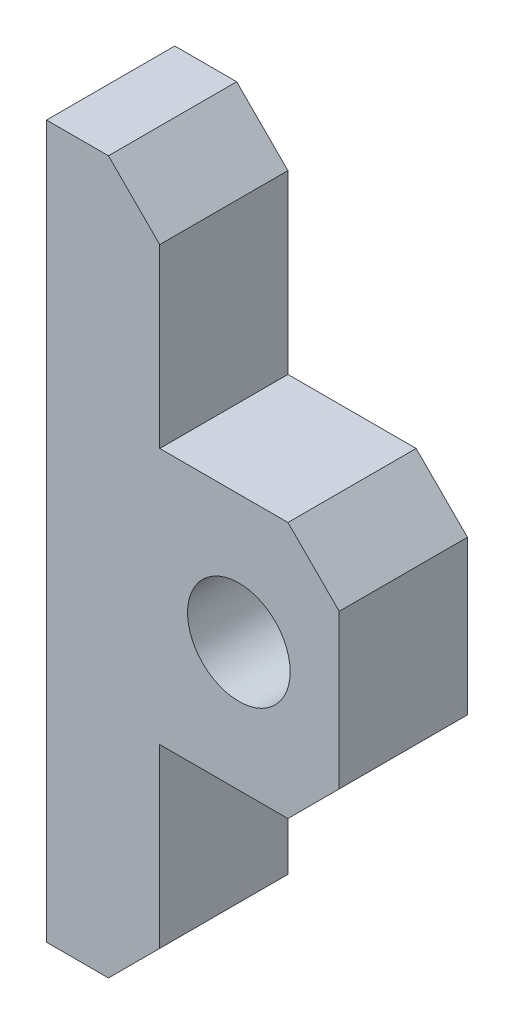
ISO-10303-21;
HEADER;
FILE_DESCRIPTION(('STEP AP214'),'2;1');
FILE_NAME('part.step','',(''),(''),'','','');
FILE_SCHEMA(('AUTOMOTIVE_DESIGN { 1 0 10303 214 1 1 1 1 }'));
ENDSEC;
DATA;
#1=APPLICATION_CONTEXT('core data for automotive mechanical design processes');
#2=APPLICATION_PROTOCOL_DEFINITION('international standard','automotive_design',2000,#1);
#3=PRODUCT_CONTEXT('',#1,'mechanical');
#4=PRODUCT('Part','Part','',(#3));
#5=PRODUCT_RELATED_PRODUCT_CATEGORY('part','',(#4));
#6=PRODUCT_DEFINITION_FORMATION('','',#4);
#7=PRODUCT_DEFINITION_CONTEXT('part definition',#1,'design');
#8=PRODUCT_DEFINITION('design','',#6,#7);
#9=PRODUCT_DEFINITION_SHAPE('','',#8);
#10=(LENGTH_UNIT() NAMED_UNIT(*) SI_UNIT(.MILLI.,.METRE.));
#11=(NAMED_UNIT(*) PLANE_ANGLE_UNIT() SI_UNIT($,.RADIAN.));
#12=(NAMED_UNIT(*) SI_UNIT($,.STERADIAN.) SOLID_ANGLE_UNIT());
#13=UNCERTAINTY_MEASURE_WITH_UNIT(LENGTH_MEASURE(1.E-05),#10,'distance_accuracy_value','');
#14=(GEOMETRIC_REPRESENTATION_CONTEXT(3) GLOBAL_UNCERTAINTY_ASSIGNED_CONTEXT((#13)) GLOBAL_UNIT_ASSIGNED_CONTEXT((#10,
#11,#12)) REPRESENTATION_CONTEXT('',''));
#15=CARTESIAN_POINT('',(0.,0.,0.));
#16=DIRECTION('',(0.,0.,1.));
#17=DIRECTION('',(1.,0.,0.));
#18=AXIS2_PLACEMENT_3D('',#15,#16,#17);
#19=CARTESIAN_POINT('',(25.,-12.8601720103916,10.));
#20=DIRECTION('',(0.,0.,1.));
#21=DIRECTION('',(1.,0.,0.));
#22=AXIS2_PLACEMENT_3D('',#19,#20,#21);
#23=PLANE('',#22);
#24=DIRECTION('',(0.,-1.,0.));
#25=VECTOR('',#24,1.);
#26=CARTESIAN_POINT('',(8.82861320662202,-50.6305555757172,10.));
#27=LINE('',#26,#25);
#28=CARTESIAN_POINT('',(8.82861320662202,-50.6305555757172,10.));
#29=VERTEX_POINT('',#28);
#30=CARTESIAN_POINT('',(8.82861320662203,-64.4009391410427,10.));
#31=VERTEX_POINT('',#30);
#32=EDGE_CURVE('E123',#29,#31,#27,.T.);
#33=ORIENTED_EDGE('',*,*,#32,.T.);
#34=DIRECTION('',(0.707106781186546,0.707106781186549,0.));
#35=VECTOR('',#34,1.);
#36=CARTESIAN_POINT('',(4.82861320662202,-68.4009391410427,10.));
#37=LINE('',#36,#35);
#38=CARTESIAN_POINT('',(4.82861320662202,-68.4009391410427,10.));
#39=VERTEX_POINT('',#38);
#40=EDGE_CURVE('E203',#31,#39,#37,.F.);
#41=ORIENTED_EDGE('',*,*,#40,.T.);
#42=DIRECTION('',(-1.,0.,0.));
#43=VECTOR('',#42,1.);
#44=CARTESIAN_POINT('',(25.,-68.4009391410427,10.));
#45=LINE('',#44,#43);
#46=CARTESIAN_POINT('',(0.,-68.4009391410427,10.));
#47=VERTEX_POINT('',#46);
#48=EDGE_CURVE('E178',#39,#47,#45,.T.);
#49=ORIENTED_EDGE('',*,*,#48,.T.);
#50=DIRECTION('',(0.,1.,0.));
#51=VECTOR('',#50,1.);
#52=CARTESIAN_POINT('',(0.,-12.8601720103916,10.));
#53=LINE('',#52,#51);
#54=CARTESIAN_POINT('',(0.,-12.8601720103916,10.));
#55=VERTEX_POINT('',#54);
#56=EDGE_CURVE('E164',#47,#55,#53,.T.);
#57=ORIENTED_EDGE('',*,*,#56,.T.);
#58=DIRECTION('',(-1.,0.,0.));
#59=VECTOR('',#58,1.);
#60=CARTESIAN_POINT('',(25.,-12.8601720103916,10.));
#61=LINE('',#60,#59);
#62=CARTESIAN_POINT('',(4.82861320662201,-12.8601720103916,10.));
#63=VERTEX_POINT('',#62);
#64=EDGE_CURVE('E184',#63,#55,#61,.T.);
#65=ORIENTED_EDGE('',*,*,#64,.F.);
#66=DIRECTION('',(-0.707106781186549,0.707106781186546,0.));
#67=VECTOR('',#66,1.);
#68=CARTESIAN_POINT('',(8.82861320662202,-16.8601720103916,10.));
#69=LINE('',#68,#67);
#70=CARTESIAN_POINT('',(8.82861320662202,-16.8601720103916,10.));
#71=VERTEX_POINT('',#70);
#72=EDGE_CURVE('E201',#63,#71,#69,.F.);
#73=ORIENTED_EDGE('',*,*,#72,.T.);
#74=DIRECTION('',(0.,-1.,0.));
#75=VECTOR('',#74,1.);
#76=CARTESIAN_POINT('',(8.82861320662202,-30.6305555757171,10.));
#77=LINE('',#76,#75);
#78=CARTESIAN_POINT('',(8.82861320662202,-30.6305555757171,10.));
#79=VERTEX_POINT('',#78);
#80=EDGE_CURVE('E138',#71,#79,#77,.T.);
#81=ORIENTED_EDGE('',*,*,#80,.T.);
#82=DIRECTION('',(1.,0.,0.));
#83=VECTOR('',#82,1.);
#84=CARTESIAN_POINT('',(22.828613206622,-30.6305555757171,10.));
#85=LINE('',#84,#83);
#86=CARTESIAN_POINT('',(18.828613206622,-30.6305555757171,10.));
#87=VERTEX_POINT('',#86);
#88=EDGE_CURVE('E157',#79,#87,#85,.T.);
#89=ORIENTED_EDGE('',*,*,#88,.T.);
#90=DIRECTION('',(-0.707106781186549,0.707106781186546,0.));
#91=VECTOR('',#90,1.);
#92=CARTESIAN_POINT('',(22.828613206622,-34.6305555757172,10.));
#93=LINE('',#92,#91);
#94=CARTESIAN_POINT('',(22.828613206622,-34.6305555757172,10.));
#95=VERTEX_POINT('',#94);
#96=EDGE_CURVE('E199',#87,#95,#93,.F.);
#97=ORIENTED_EDGE('',*,*,#96,.T.);
#98=DIRECTION('',(0.,-1.,0.));
#99=VECTOR('',#98,1.);
#100=CARTESIAN_POINT('',(22.828613206622,-50.6305555757172,10.));
#101=LINE('',#100,#99);
#102=CARTESIAN_POINT('',(22.828613206622,-46.6305555757171,10.));
#103=VERTEX_POINT('',#102);
#104=EDGE_CURVE('E127',#95,#103,#101,.T.);
#105=ORIENTED_EDGE('',*,*,#104,.T.);
#106=DIRECTION('',(0.707106781186547,0.707106781186548,0.));
#107=VECTOR('',#106,1.);
#108=CARTESIAN_POINT('',(18.828613206622,-50.6305555757172,10.));
#109=LINE('',#108,#107);
#110=CARTESIAN_POINT('',(18.828613206622,-50.6305555757172,10.));
#111=VERTEX_POINT('',#110);
#112=EDGE_CURVE('E45',#103,#111,#109,.F.);
#113=ORIENTED_EDGE('',*,*,#112,.T.);
#114=DIRECTION('',(-1.,0.,0.));
#115=VECTOR('',#114,1.);
#116=CARTESIAN_POINT('',(22.828613206622,-50.6305555757172,10.));
#117=LINE('',#116,#115);
#118=EDGE_CURVE('E119',#111,#29,#117,.T.);
#119=ORIENTED_EDGE('',*,*,#118,.T.);
#120=EDGE_LOOP('',(#33,#41,#49,#57,#65,#73,#81,#89,#97,#105,#113,#119));
#121=FACE_BOUND('',#120,.T.);
#122=CARTESIAN_POINT('',(15.,-40.6305555757172,10.));
#123=DIRECTION('',(0.,0.,1.));
#124=DIRECTION('',(1.,0.,0.));
#125=AXIS2_PLACEMENT_3D('',#122,#123,#124);
#126=CIRCLE('',#125,4.00000000104675);
#127=CARTESIAN_POINT('',(19.0000000010468,-40.6305555757172,10.));
#128=VERTEX_POINT('',#127);
#129=EDGE_CURVE('E161',#128,#128,#126,.T.);
#130=ORIENTED_EDGE('',*,*,#129,.T.);
#131=EDGE_LOOP('',(#130));
#132=FACE_BOUND('',#131,.T.);
#133=ADVANCED_FACE('F30',(#121,#132),#23,.F.);
#134=CARTESIAN_POINT('',(25.,-12.8601720103916,20.));
#135=DIRECTION('',(0.,-1.,0.));
#136=DIRECTION('',(0.,0.,-1.));
#137=AXIS2_PLACEMENT_3D('',#134,#135,#136);
#138=PLANE('',#137);
#139=DIRECTION('',(-1.,0.,0.));
#140=VECTOR('',#139,1.);
#141=CARTESIAN_POINT('',(25.,-12.8601720103916,20.));
#142=LINE('',#141,#140);
#143=CARTESIAN_POINT('',(4.82861320662201,-12.8601720103916,20.));
#144=VERTEX_POINT('',#143);
#145=CARTESIAN_POINT('',(0.,-12.8601720103916,20.));
#146=VERTEX_POINT('',#145);
#147=EDGE_CURVE('E182',#144,#146,#142,.T.);
#148=ORIENTED_EDGE('',*,*,#147,.F.);
#149=DIRECTION('',(0.,0.,-1.));
#150=VECTOR('',#149,1.);
#151=CARTESIAN_POINT('',(4.82861320662201,-12.8601720103916,20.));
#152=LINE('',#151,#150);
#153=EDGE_CURVE('E208',#144,#63,#152,.T.);
#154=ORIENTED_EDGE('',*,*,#153,.T.);
#155=ORIENTED_EDGE('',*,*,#64,.T.);
#156=DIRECTION('',(0.,0.,1.));
#157=VECTOR('',#156,1.);
#158=CARTESIAN_POINT('',(0.,-12.8601720103916,20.));
#159=LINE('',#158,#157);
#160=EDGE_CURVE('E169',#55,#146,#159,.T.);
#161=ORIENTED_EDGE('',*,*,#160,.T.);
#162=EDGE_LOOP('',(#148,#154,#155,#161));
#163=FACE_BOUND('',#162,.T.);
#164=ADVANCED_FACE('F238',(#163),#138,.F.);
#165=CARTESIAN_POINT('',(25.,-12.8601720103916,20.));
#166=DIRECTION('',(0.,0.,-1.));
#167=DIRECTION('',(-1.,0.,0.));
#168=AXIS2_PLACEMENT_3D('',#165,#166,#167);
#169=PLANE('',#168);
#170=CARTESIAN_POINT('',(15.,-40.6305555757172,20.));
#171=DIRECTION('',(0.,0.,1.));
#172=DIRECTION('',(1.,0.,0.));
#173=AXIS2_PLACEMENT_3D('',#170,#171,#172);
#174=CIRCLE('',#173,4.00000000104675);
#175=CARTESIAN_POINT('',(19.0000000010468,-40.6305555757172,20.));
#176=VERTEX_POINT('',#175);
#177=EDGE_CURVE('E159',#176,#176,#174,.T.);
#178=ORIENTED_EDGE('',*,*,#177,.F.);
#179=EDGE_LOOP('',(#178));
#180=FACE_BOUND('',#179,.T.);
#181=DIRECTION('',(-1.,0.,0.));
#182=VECTOR('',#181,1.);
#183=CARTESIAN_POINT('',(25.,-68.4009391410427,20.));
#184=LINE('',#183,#182);
#185=CARTESIAN_POINT('',(4.82861320662202,-68.4009391410427,20.));
#186=VERTEX_POINT('',#185);
#187=CARTESIAN_POINT('',(0.,-68.4009391410427,20.));
#188=VERTEX_POINT('',#187);
#189=EDGE_CURVE('E180',#186,#188,#184,.T.);
#190=ORIENTED_EDGE('',*,*,#189,.F.);
#191=DIRECTION('',(-0.707106781186546,-0.707106781186549,0.));
#192=VECTOR('',#191,1.);
#193=CARTESIAN_POINT('',(4.82861320662202,-68.4009391410427,20.));
#194=LINE('',#193,#192);
#195=CARTESIAN_POINT('',(8.82861320662203,-64.4009391410427,20.));
#196=VERTEX_POINT('',#195);
#197=EDGE_CURVE('E195',#186,#196,#194,.F.);
#198=ORIENTED_EDGE('',*,*,#197,.T.);
#199=DIRECTION('',(0.,-1.,0.));
#200=VECTOR('',#199,1.);
#201=CARTESIAN_POINT('',(8.82861320662202,-50.6305555757172,20.));
#202=LINE('',#201,#200);
#203=CARTESIAN_POINT('',(8.82861320662202,-50.6305555757172,20.));
#204=VERTEX_POINT('',#203);
#205=EDGE_CURVE('E153',#204,#196,#202,.T.);
#206=ORIENTED_EDGE('',*,*,#205,.F.);
#207=DIRECTION('',(-1.,0.,0.));
#208=VECTOR('',#207,1.);
#209=CARTESIAN_POINT('',(22.828613206622,-50.6305555757172,20.));
#210=LINE('',#209,#208);
#211=CARTESIAN_POINT('',(18.828613206622,-50.6305555757172,20.));
#212=VERTEX_POINT('',#211);
#213=EDGE_CURVE('E133',#212,#204,#210,.T.);
#214=ORIENTED_EDGE('',*,*,#213,.F.);
#215=DIRECTION('',(-0.707106781186547,-0.707106781186548,0.));
#216=VECTOR('',#215,1.);
#217=CARTESIAN_POINT('',(18.828613206622,-50.6305555757172,20.));
#218=LINE('',#217,#216);
#219=CARTESIAN_POINT('',(22.828613206622,-46.6305555757171,20.));
#220=VERTEX_POINT('',#219);
#221=EDGE_CURVE('E189',#212,#220,#218,.F.);
#222=ORIENTED_EDGE('',*,*,#221,.T.);
#223=DIRECTION('',(0.,-1.,0.));
#224=VECTOR('',#223,1.);
#225=CARTESIAN_POINT('',(22.828613206622,-50.6305555757172,20.));
#226=LINE('',#225,#224);
#227=CARTESIAN_POINT('',(22.828613206622,-34.6305555757172,20.));
#228=VERTEX_POINT('',#227);
#229=EDGE_CURVE('E150',#228,#220,#226,.T.);
#230=ORIENTED_EDGE('',*,*,#229,.F.);
#231=DIRECTION('',(0.707106781186549,-0.707106781186546,0.));
#232=VECTOR('',#231,1.);
#233=CARTESIAN_POINT('',(22.828613206622,-34.6305555757172,20.));
#234=LINE('',#233,#232);
#235=CARTESIAN_POINT('',(18.828613206622,-30.6305555757171,20.));
#236=VERTEX_POINT('',#235);
#237=EDGE_CURVE('E191',#228,#236,#234,.F.);
#238=ORIENTED_EDGE('',*,*,#237,.T.);
#239=DIRECTION('',(1.,0.,0.));
#240=VECTOR('',#239,1.);
#241=CARTESIAN_POINT('',(22.828613206622,-30.6305555757171,20.));
#242=LINE('',#241,#240);
#243=CARTESIAN_POINT('',(8.82861320662202,-30.6305555757171,20.));
#244=VERTEX_POINT('',#243);
#245=EDGE_CURVE('E147',#244,#236,#242,.T.);
#246=ORIENTED_EDGE('',*,*,#245,.F.);
#247=DIRECTION('',(0.,-1.,0.));
#248=VECTOR('',#247,1.);
#249=CARTESIAN_POINT('',(8.82861320662202,-30.6305555757171,20.));
#250=LINE('',#249,#248);
#251=CARTESIAN_POINT('',(8.82861320662202,-16.8601720103916,20.));
#252=VERTEX_POINT('',#251);
#253=EDGE_CURVE('E155',#252,#244,#250,.T.);
#254=ORIENTED_EDGE('',*,*,#253,.F.);
#255=DIRECTION('',(0.707106781186549,-0.707106781186546,0.));
#256=VECTOR('',#255,1.);
#257=CARTESIAN_POINT('',(8.82861320662202,-16.8601720103916,20.));
#258=LINE('',#257,#256);
#259=EDGE_CURVE('E193',#252,#144,#258,.F.);
#260=ORIENTED_EDGE('',*,*,#259,.T.);
#261=ORIENTED_EDGE('',*,*,#147,.T.);
#262=DIRECTION('',(0.,-1.,0.));
#263=VECTOR('',#262,1.);
#264=CARTESIAN_POINT('',(0.,-12.8601720103916,20.));
#265=LINE('',#264,#263);
#266=EDGE_CURVE('E172',#146,#188,#265,.T.);
#267=ORIENTED_EDGE('',*,*,#266,.T.);
#268=EDGE_LOOP('',(#190,#198,#206,#214,#222,#230,#238,#246,#254,#260,#261,#267));
#269=FACE_BOUND('',#268,.T.);
#270=ADVANCED_FACE('F230',(#180,#269),#169,.F.);
#271=CARTESIAN_POINT('',(25.,-68.4009391410427,20.));
#272=DIRECTION('',(0.,1.,0.));
#273=DIRECTION('',(0.,0.,1.));
#274=AXIS2_PLACEMENT_3D('',#271,#272,#273);
#275=PLANE('',#274);
#276=ORIENTED_EDGE('',*,*,#48,.F.);
#277=DIRECTION('',(0.,0.,1.));
#278=VECTOR('',#277,1.);
#279=CARTESIAN_POINT('',(4.82861320662202,-68.4009391410427,20.));
#280=LINE('',#279,#278);
#281=EDGE_CURVE('E186',#39,#186,#280,.T.);
#282=ORIENTED_EDGE('',*,*,#281,.T.);
#283=ORIENTED_EDGE('',*,*,#189,.T.);
#284=DIRECTION('',(0.,0.,-1.));
#285=VECTOR('',#284,1.);
#286=CARTESIAN_POINT('',(0.,-68.4009391410427,20.));
#287=LINE('',#286,#285);
#288=EDGE_CURVE('E175',#188,#47,#287,.T.);
#289=ORIENTED_EDGE('',*,*,#288,.T.);
#290=EDGE_LOOP('',(#276,#282,#283,#289));
#291=FACE_BOUND('',#290,.T.);
#292=ADVANCED_FACE('F271',(#291),#275,.F.);
#293=CARTESIAN_POINT('',(0.,-68.4009391410427,10.));
#294=DIRECTION('',(1.,0.,0.));
#295=DIRECTION('',(0.,0.,-1.));
#296=AXIS2_PLACEMENT_3D('',#293,#294,#295);
#297=PLANE('',#296);
#298=ORIENTED_EDGE('',*,*,#56,.F.);
#299=ORIENTED_EDGE('',*,*,#288,.F.);
#300=ORIENTED_EDGE('',*,*,#266,.F.);
#301=ORIENTED_EDGE('',*,*,#160,.F.);
#302=EDGE_LOOP('',(#298,#299,#300,#301));
#303=FACE_BOUND('',#302,.T.);
#304=ADVANCED_FACE('F268',(#303),#297,.F.);
#305=CARTESIAN_POINT('',(15.,-40.6305555757172,10.));
#306=DIRECTION('',(0.,0.,1.));
#307=DIRECTION('',(1.,0.,0.));
#308=AXIS2_PLACEMENT_3D('',#305,#306,#307);
#309=CYLINDRICAL_SURFACE('',#308,4.00000000104675);
#310=ORIENTED_EDGE('',*,*,#129,.F.);
#311=EDGE_LOOP('',(#310));
#312=FACE_BOUND('',#311,.T.);
#313=ORIENTED_EDGE('',*,*,#177,.T.);
#314=EDGE_LOOP('',(#313));
#315=FACE_BOUND('',#314,.T.);
#316=ADVANCED_FACE('F279',(#312,#315),#309,.F.);
#317=CARTESIAN_POINT('',(22.828613206622,-30.6305555757171,10.));
#318=DIRECTION('',(0.,-1.,0.));
#319=DIRECTION('',(0.,0.,-1.));
#320=AXIS2_PLACEMENT_3D('',#317,#318,#319);
#321=PLANE('',#320);
#322=ORIENTED_EDGE('',*,*,#245,.T.);
#323=DIRECTION('',(0.,0.,-1.));
#324=VECTOR('',#323,1.);
#325=CARTESIAN_POINT('',(18.828613206622,-30.6305555757171,10.));
#326=LINE('',#325,#324);
#327=EDGE_CURVE('E38',#236,#87,#326,.T.);
#328=ORIENTED_EDGE('',*,*,#327,.T.);
#329=ORIENTED_EDGE('',*,*,#88,.F.);
#330=DIRECTION('',(0.,0.,1.));
#331=VECTOR('',#330,1.);
#332=CARTESIAN_POINT('',(8.82861320662202,-30.6305555757171,10.));
#333=LINE('',#332,#331);
#334=EDGE_CURVE('E137',#79,#244,#333,.T.);
#335=ORIENTED_EDGE('',*,*,#334,.T.);
#336=EDGE_LOOP('',(#322,#328,#329,#335));
#337=FACE_BOUND('',#336,.T.);
#338=ADVANCED_FACE('F217',(#337),#321,.F.);
#339=CARTESIAN_POINT('',(8.82861320662202,-30.6305555757171,10.));
#340=DIRECTION('',(-1.,0.,0.));
#341=DIRECTION('',(0.,0.,1.));
#342=AXIS2_PLACEMENT_3D('',#339,#340,#341);
#343=PLANE('',#342);
#344=ORIENTED_EDGE('',*,*,#80,.F.);
#345=DIRECTION('',(0.,0.,1.));
#346=VECTOR('',#345,1.);
#347=CARTESIAN_POINT('',(8.82861320662202,-16.8601720103916,10.));
#348=LINE('',#347,#346);
#349=EDGE_CURVE('E205',#71,#252,#348,.T.);
#350=ORIENTED_EDGE('',*,*,#349,.T.);
#351=ORIENTED_EDGE('',*,*,#253,.T.);
#352=ORIENTED_EDGE('',*,*,#334,.F.);
#353=EDGE_LOOP('',(#344,#350,#351,#352));
#354=FACE_BOUND('',#353,.T.);
#355=ADVANCED_FACE('F260',(#354),#343,.F.);
#356=CARTESIAN_POINT('',(8.82861320662202,-50.6305555757172,10.));
#357=DIRECTION('',(-1.,0.,0.));
#358=DIRECTION('',(0.,-1.,0.));
#359=AXIS2_PLACEMENT_3D('',#356,#357,#358);
#360=PLANE('',#359);
#361=ORIENTED_EDGE('',*,*,#205,.T.);
#362=DIRECTION('',(0.,0.,-1.));
#363=VECTOR('',#362,1.);
#364=CARTESIAN_POINT('',(8.82861320662203,-64.4009391410427,10.));
#365=LINE('',#364,#363);
#366=EDGE_CURVE('E142',#196,#31,#365,.T.);
#367=ORIENTED_EDGE('',*,*,#366,.T.);
#368=ORIENTED_EDGE('',*,*,#32,.F.);
#369=DIRECTION('',(0.,0.,1.));
#370=VECTOR('',#369,1.);
#371=CARTESIAN_POINT('',(8.82861320662202,-50.6305555757172,10.));
#372=LINE('',#371,#370);
#373=EDGE_CURVE('E130',#29,#204,#372,.T.);
#374=ORIENTED_EDGE('',*,*,#373,.T.);
#375=EDGE_LOOP('',(#361,#367,#368,#374));
#376=FACE_BOUND('',#375,.T.);
#377=ADVANCED_FACE('F140',(#376),#360,.F.);
#378=CARTESIAN_POINT('',(22.828613206622,-50.6305555757172,10.));
#379=DIRECTION('',(0.,1.,0.));
#380=DIRECTION('',(0.,0.,1.));
#381=AXIS2_PLACEMENT_3D('',#378,#379,#380);
#382=PLANE('',#381);
#383=ORIENTED_EDGE('',*,*,#118,.F.);
#384=DIRECTION('',(0.,0.,1.));
#385=VECTOR('',#384,1.);
#386=CARTESIAN_POINT('',(18.828613206622,-50.6305555757172,10.));
#387=LINE('',#386,#385);
#388=EDGE_CURVE('E11',#111,#212,#387,.T.);
#389=ORIENTED_EDGE('',*,*,#388,.T.);
#390=ORIENTED_EDGE('',*,*,#213,.T.);
#391=ORIENTED_EDGE('',*,*,#373,.F.);
#392=EDGE_LOOP('',(#383,#389,#390,#391));
#393=FACE_BOUND('',#392,.T.);
#394=ADVANCED_FACE('F131',(#393),#382,.F.);
#395=CARTESIAN_POINT('',(22.828613206622,-50.6305555757172,10.));
#396=DIRECTION('',(-1.,0.,0.));
#397=DIRECTION('',(0.,0.,1.));
#398=AXIS2_PLACEMENT_3D('',#395,#396,#397);
#399=PLANE('',#398);
#400=ORIENTED_EDGE('',*,*,#104,.F.);
#401=DIRECTION('',(0.,0.,1.));
#402=VECTOR('',#401,1.);
#403=CARTESIAN_POINT('',(22.828613206622,-34.6305555757172,10.));
#404=LINE('',#403,#402);
#405=EDGE_CURVE('E211',#95,#228,#404,.T.);
#406=ORIENTED_EDGE('',*,*,#405,.T.);
#407=ORIENTED_EDGE('',*,*,#229,.T.);
#408=DIRECTION('',(0.,0.,-1.));
#409=VECTOR('',#408,1.);
#410=CARTESIAN_POINT('',(22.828613206622,-46.6305555757171,10.));
#411=LINE('',#410,#409);
#412=EDGE_CURVE('E53',#220,#103,#411,.T.);
#413=ORIENTED_EDGE('',*,*,#412,.T.);
#414=EDGE_LOOP('',(#400,#406,#407,#413));
#415=FACE_BOUND('',#414,.T.);
#416=ADVANCED_FACE('F227',(#415),#399,.F.);
#417=CARTESIAN_POINT('',(4.82861320662202,-68.4009391410427,20.));
#418=DIRECTION('',(-0.707106781186549,0.707106781186546,0.));
#419=DIRECTION('',(-0.707106781186546,-0.707106781186549,0.));
#420=AXIS2_PLACEMENT_3D('',#417,#418,#419);
#421=PLANE('',#420);
#422=ORIENTED_EDGE('',*,*,#40,.F.);
#423=ORIENTED_EDGE('',*,*,#366,.F.);
#424=ORIENTED_EDGE('',*,*,#197,.F.);
#425=ORIENTED_EDGE('',*,*,#281,.F.);
#426=EDGE_LOOP('',(#422,#423,#424,#425));
#427=FACE_BOUND('',#426,.T.);
#428=ADVANCED_FACE('F247',(#427),#421,.F.);
#429=CARTESIAN_POINT('',(8.82861320662202,-16.8601720103916,10.));
#430=DIRECTION('',(-0.707106781186546,-0.707106781186549,0.));
#431=DIRECTION('',(0.707106781186549,-0.707106781186546,0.));
#432=AXIS2_PLACEMENT_3D('',#429,#430,#431);
#433=PLANE('',#432);
#434=ORIENTED_EDGE('',*,*,#72,.F.);
#435=ORIENTED_EDGE('',*,*,#153,.F.);
#436=ORIENTED_EDGE('',*,*,#259,.F.);
#437=ORIENTED_EDGE('',*,*,#349,.F.);
#438=EDGE_LOOP('',(#434,#435,#436,#437));
#439=FACE_BOUND('',#438,.T.);
#440=ADVANCED_FACE('F236',(#439),#433,.F.);
#441=CARTESIAN_POINT('',(22.828613206622,-34.6305555757172,10.));
#442=DIRECTION('',(-0.707106781186546,-0.707106781186549,0.));
#443=DIRECTION('',(0.707106781186549,-0.707106781186546,0.));
#444=AXIS2_PLACEMENT_3D('',#441,#442,#443);
#445=PLANE('',#444);
#446=ORIENTED_EDGE('',*,*,#96,.F.);
#447=ORIENTED_EDGE('',*,*,#327,.F.);
#448=ORIENTED_EDGE('',*,*,#237,.F.);
#449=ORIENTED_EDGE('',*,*,#405,.F.);
#450=EDGE_LOOP('',(#446,#447,#448,#449));
#451=FACE_BOUND('',#450,.T.);
#452=ADVANCED_FACE('F225',(#451),#445,.F.);
#453=CARTESIAN_POINT('',(18.828613206622,-50.6305555757172,10.));
#454=DIRECTION('',(-0.707106781186548,0.707106781186547,0.));
#455=DIRECTION('',(-0.707106781186547,-0.707106781186548,0.));
#456=AXIS2_PLACEMENT_3D('',#453,#454,#455);
#457=PLANE('',#456);
#458=ORIENTED_EDGE('',*,*,#112,.F.);
#459=ORIENTED_EDGE('',*,*,#412,.F.);
#460=ORIENTED_EDGE('',*,*,#221,.F.);
#461=ORIENTED_EDGE('',*,*,#388,.F.);
#462=EDGE_LOOP('',(#458,#459,#460,#461));
#463=FACE_BOUND('',#462,.T.);
#464=ADVANCED_FACE('F32',(#463),#457,.F.);
#465=CLOSED_SHELL('',(#133,#164,#270,#292,#304,#316,#338,#355,#377,#394,#416,#428,#440,#452,#464));
#466=MANIFOLD_SOLID_BREP('B2',#465);
#467=ADVANCED_BREP_SHAPE_REPRESENTATION('',(#18,#466),#14);
#468=SHAPE_DEFINITION_REPRESENTATION(#9,#467);
ENDSEC;
END-ISO-10303-21;
